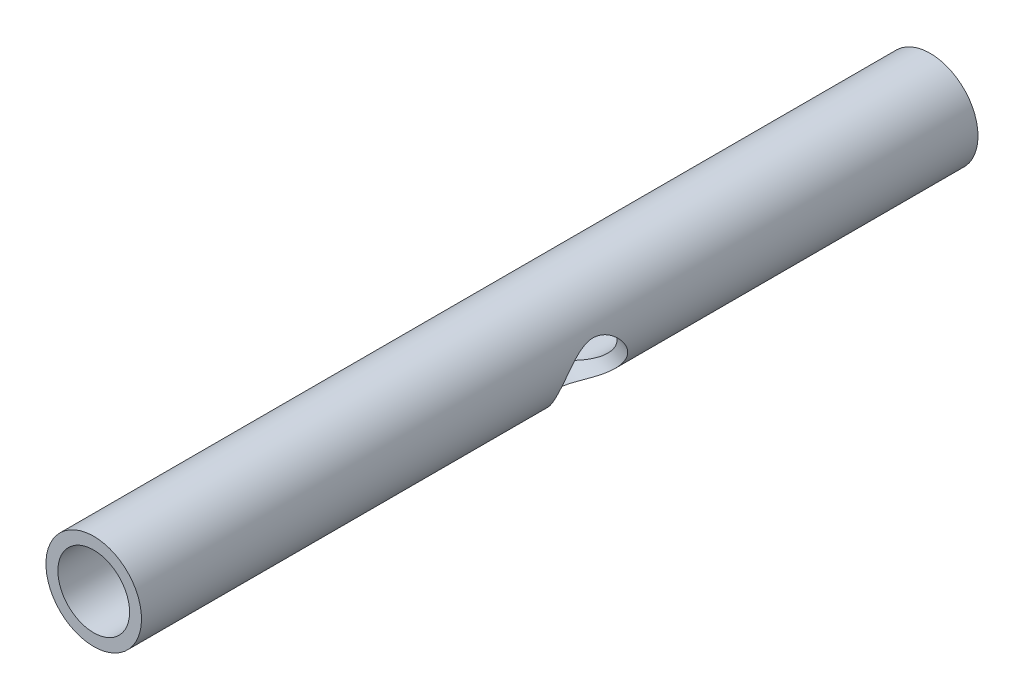
ISO-10303-21;
HEADER;
FILE_DESCRIPTION(('STEP AP214'),'2;1');
FILE_NAME('part.step','',(''),(''),'','','');
FILE_SCHEMA(('AUTOMOTIVE_DESIGN { 1 0 10303 214 1 1 1 1 }'));
ENDSEC;
DATA;
#1=APPLICATION_CONTEXT('core data for automotive mechanical design processes');
#2=APPLICATION_PROTOCOL_DEFINITION('international standard','automotive_design',2000,#1);
#3=PRODUCT_CONTEXT('',#1,'mechanical');
#4=PRODUCT('Part','Part','',(#3));
#5=PRODUCT_RELATED_PRODUCT_CATEGORY('part','',(#4));
#6=PRODUCT_DEFINITION_FORMATION('','',#4);
#7=PRODUCT_DEFINITION_CONTEXT('part definition',#1,'design');
#8=PRODUCT_DEFINITION('design','',#6,#7);
#9=PRODUCT_DEFINITION_SHAPE('','',#8);
#10=(LENGTH_UNIT() NAMED_UNIT(*) SI_UNIT(.MILLI.,.METRE.));
#11=(NAMED_UNIT(*) PLANE_ANGLE_UNIT() SI_UNIT($,.RADIAN.));
#12=(NAMED_UNIT(*) SI_UNIT($,.STERADIAN.) SOLID_ANGLE_UNIT());
#13=UNCERTAINTY_MEASURE_WITH_UNIT(LENGTH_MEASURE(1.E-05),#10,'distance_accuracy_value','');
#14=(GEOMETRIC_REPRESENTATION_CONTEXT(3) GLOBAL_UNCERTAINTY_ASSIGNED_CONTEXT((#13)) GLOBAL_UNIT_ASSIGNED_CONTEXT((#10,
#11,#12)) REPRESENTATION_CONTEXT('',''));
#15=CARTESIAN_POINT('',(0.,0.,0.));
#16=DIRECTION('',(0.,0.,1.));
#17=DIRECTION('',(1.,0.,0.));
#18=AXIS2_PLACEMENT_3D('',#15,#16,#17);
#19=CARTESIAN_POINT('',(80.,-9.99999999999995,-30.9999999999491));
#20=DIRECTION('',(0.,0.,-1.));
#21=DIRECTION('',(-1.,0.,0.));
#22=AXIS2_PLACEMENT_3D('',#19,#20,#21);
#23=CONICAL_SURFACE('',#22,3.49999999990132,0.785398163397448);
#24=CARTESIAN_POINT('',(80.,-9.99999999999995,-31.0000000000628));
#25=DIRECTION('',(0.,0.,-1.));
#26=DIRECTION('',(-1.,0.,0.));
#27=AXIS2_PLACEMENT_3D('',#24,#25,#26);
#28=CIRCLE('',#27,3.500000000015);
#29=CARTESIAN_POINT('',(76.499999999985,-9.99999999999995,-31.0000000000628));
#30=VERTEX_POINT('',#29);
#31=EDGE_CURVE('E50',#30,#30,#28,.F.);
#32=ORIENTED_EDGE('',*,*,#31,.F.);
#33=EDGE_LOOP('',(#32));
#34=FACE_BOUND('',#33,.T.);
#35=CARTESIAN_POINT('',(80.,-9.99999999999995,-30.5));
#36=DIRECTION('',(0.,0.,1.));
#37=DIRECTION('',(1.,0.,0.));
#38=AXIS2_PLACEMENT_3D('',#35,#36,#37);
#39=CIRCLE('',#38,3.);
#40=CARTESIAN_POINT('',(83.,-9.99999999999995,-30.5));
#41=VERTEX_POINT('',#40);
#42=EDGE_CURVE('E75',#41,#41,#39,.T.);
#43=ORIENTED_EDGE('',*,*,#42,.T.);
#44=EDGE_LOOP('',(#43));
#45=FACE_BOUND('',#44,.T.);
#46=ADVANCED_FACE('F15',(#34,#45),#23,.F.);
#47=CARTESIAN_POINT('',(80.,-9.99999999999995,0.));
#48=DIRECTION('',(0.,0.,1.));
#49=DIRECTION('',(1.,0.,0.));
#50=AXIS2_PLACEMENT_3D('',#47,#48,#49);
#51=CYLINDRICAL_SURFACE('',#50,3.);
#52=CARTESIAN_POINT('',(77.,-9.99999999999999,20.25));
#53=CARTESIAN_POINT('',(77.0000031485929,-9.93297141008562,20.2499961102526));
#54=CARTESIAN_POINT('',(77.002269933054,-9.86588731745749,20.244582131157));
#55=CARTESIAN_POINT('',(77.0111072162327,-9.73367931080488,20.2231401272017));
#56=CARTESIAN_POINT('',(77.0176836055028,-9.66855820749588,20.2070975744215));
#57=CARTESIAN_POINT('',(77.0344356916935,-9.54231875275988,20.1650923139111));
#58=CARTESIAN_POINT('',(77.0446008924674,-9.48118933818353,20.1391585173857));
#59=CARTESIAN_POINT('',(77.0675433360689,-9.3641876001995,20.0782376099593));
#60=CARTESIAN_POINT('',(77.0803205719993,-9.30831526291092,20.0432505229637));
#61=CARTESIAN_POINT('',(77.1079212190996,-9.20055335261162,19.9633725568439));
#62=CARTESIAN_POINT('',(77.1228114400232,-9.14896232220842,19.9181022615885));
#63=CARTESIAN_POINT('',(77.152671806227,-9.05384321271223,19.8197389445801));
#64=CARTESIAN_POINT('',(77.1676419937418,-9.010319942958,19.7666412904342));
#65=CARTESIAN_POINT('',(77.196796076901,-8.93044567806568,19.6509500762096));
#66=CARTESIAN_POINT('',(77.2109041324783,-8.8945575572646,19.5880161275675));
#67=CARTESIAN_POINT('',(77.2356530672334,-8.83403912431057,19.4563626360506));
#68=CARTESIAN_POINT('',(77.246298607252,-8.80939366043413,19.3876510286108));
#69=CARTESIAN_POINT('',(77.260399614788,-8.77737850465986,19.2655847979809));
#70=CARTESIAN_POINT('',(77.2650209812007,-8.76713924856231,19.2131025538806));
#71=CARTESIAN_POINT('',(77.2712330011342,-8.75344964092459,19.1070857432364));
#72=CARTESIAN_POINT('',(77.2728242989587,-8.74999784611646,19.0535514028534));
#73=CARTESIAN_POINT('',(77.2728190686612,-8.7500026860229,18.9332181652831));
#74=CARTESIAN_POINT('',(77.2703378239471,-8.75537681379133,18.8664097957));
#75=CARTESIAN_POINT('',(77.2607473180041,-8.77663407274414,18.7348048620552));
#76=CARTESIAN_POINT('',(77.2536341000203,-8.79252618886455,18.6700100676683));
#77=CARTESIAN_POINT('',(77.2357330322845,-8.83409532562654,18.5444489707837));
#78=CARTESIAN_POINT('',(77.224957520494,-8.85973952636007,18.4836699501118));
#79=CARTESIAN_POINT('',(77.2009640856482,-8.91997894687178,18.367265237404));
#80=CARTESIAN_POINT('',(77.187745698744,-8.95457586707752,18.3116405270767));
#81=CARTESIAN_POINT('',(77.1594427344018,-9.03402503869299,18.2036753113188));
#82=CARTESIAN_POINT('',(77.144295034742,-9.07934423021212,18.1516948600436));
#83=CARTESIAN_POINT('',(77.1143577433473,-9.17797620157181,18.0558018837215));
#84=CARTESIAN_POINT('',(77.0995683090171,-9.23129242350862,18.0118928509901));
#85=CARTESIAN_POINT('',(77.0712388171355,-9.34725878744316,17.9315341896755));
#86=CARTESIAN_POINT('',(77.0577817711841,-9.41021531762191,17.8954951477774));
#87=CARTESIAN_POINT('',(77.0344268531216,-9.54192919906956,17.834703337036));
#88=CARTESIAN_POINT('',(77.0245245728619,-9.61067923438856,17.8099365795162));
#89=CARTESIAN_POINT('',(77.0114458630209,-9.73304233609183,17.7776635616942));
#90=CARTESIAN_POINT('',(77.0071802233677,-9.785805833637,17.7673162208655));
#91=CARTESIAN_POINT('',(77.0014566762053,-9.89237403119688,17.7534839483506));
#92=CARTESIAN_POINT('',(76.9999983505844,-9.94617857495584,17.7499979947511));
#93=CARTESIAN_POINT('',(77.0000020553264,-10.0670665373935,17.750002498728));
#94=CARTESIAN_POINT('',(77.0022710860878,-10.1341592871934,17.7554209236394));
#95=CARTESIAN_POINT('',(77.0111116088908,-10.266356953378,17.7768702703918));
#96=CARTESIAN_POINT('',(77.0176863024883,-10.3314603528116,17.7929090893236));
#97=CARTESIAN_POINT('',(77.0344350067992,-10.4576778448451,17.8349060673278));
#98=CARTESIAN_POINT('',(77.0445993903867,-10.518802094793,17.8608377097911));
#99=CARTESIAN_POINT('',(77.0675415010204,-10.6358039500868,17.9217573019073));
#100=CARTESIAN_POINT('',(77.080319599844,-10.6916808073869,17.9567465401095));
#101=CARTESIAN_POINT('',(77.1079223659486,-10.7994512652781,18.0366308912974));
#102=CARTESIAN_POINT('',(77.1228138676326,-10.8510462035746,18.0819055758423));
#103=CARTESIAN_POINT('',(77.1526742741457,-10.9461638535712,18.1802693429486));
#104=CARTESIAN_POINT('',(77.1676432095517,-10.9896830787636,18.2333617829917));
#105=CARTESIAN_POINT('',(77.1967896741966,-11.0695371047609,18.3490263536153));
#106=CARTESIAN_POINT('',(77.2108919313469,-11.1054125786316,18.4119365559983));
#107=CARTESIAN_POINT('',(77.2356441258193,-11.1659390519261,18.5435722870955));
#108=CARTESIAN_POINT('',(77.2462957923642,-11.1905956760581,18.6122948811545));
#109=CARTESIAN_POINT('',(77.2622144403798,-11.2267459714459,18.7501536413292));
#110=CARTESIAN_POINT('',(77.267716115265,-11.2388165612478,18.819110378932));
#111=CARTESIAN_POINT('',(77.2733867374134,-11.251252098337,18.9582731861312));
#112=CARTESIAN_POINT('',(77.2735586176098,-11.2516234835825,19.0284785473382));
#113=CARTESIAN_POINT('',(77.2687488048701,-11.2410845056477,19.1624000478786));
#114=CARTESIAN_POINT('',(77.26416117455,-11.231036818318,19.22620107138));
#115=CARTESIAN_POINT('',(77.2510151757591,-11.2013919146729,19.3511120668469));
#116=CARTESIAN_POINT('',(77.2424560453016,-11.1817928657616,19.4122215199332));
#117=CARTESIAN_POINT('',(77.2221379618468,-11.1332191449996,19.5315588192327));
#118=CARTESIAN_POINT('',(77.2103147413873,-11.1040536810396,19.5896975732394));
#119=CARTESIAN_POINT('',(77.1848161806951,-11.0373109815169,19.7004796953263));
#120=CARTESIAN_POINT('',(77.1711401791667,-10.9997307394069,19.7531210893521));
#121=CARTESIAN_POINT('',(77.1420722691293,-10.9135022074293,19.856092718559));
#122=CARTESIAN_POINT('',(77.1266329485536,-10.8641875405167,19.9058530708663));
#123=CARTESIAN_POINT('',(77.0967471799468,-10.7577442894321,19.9966024842756));
#124=CARTESIAN_POINT('',(77.0823012355198,-10.7006117851581,20.0375871183532));
#125=CARTESIAN_POINT('',(77.0556073312665,-10.5784058318195,20.1104623897812));
#126=CARTESIAN_POINT('',(77.0434195405084,-10.5131763408595,20.1421146215936));
#127=CARTESIAN_POINT('',(77.0230933040136,-10.377739079338,20.1937513394168));
#128=CARTESIAN_POINT('',(77.014946788515,-10.307541552216,20.213759091497));
#129=CARTESIAN_POINT('',(77.00623445695,-10.1972185506113,20.234978706395));
#130=CARTESIAN_POINT('',(77.0039055801491,-10.1580298845302,20.2406019694152));
#131=CARTESIAN_POINT('',(77.0007874321193,-10.0792339410991,20.2481137389503));
#132=CARTESIAN_POINT('',(76.9999981385816,-10.0396266698231,20.2500022995819));
#133=CARTESIAN_POINT('',(77.,-9.99999999999999,20.25));
#134=B_SPLINE_CURVE_WITH_KNOTS('',3,(#52,#53,#54,#55,#56,#57,#58,#59,#60,#61,#62,#63,#64,#65,
#66,#67,#68,#69,#70,#71,#72,#73,#74,#75,#76,#77,#78,#79,#80,#81,#82,#83,#84,#85,#86,#87,#88,#89,
#90,#91,#92,#93,#94,#95,#96,#97,#98,#99,#100,#101,#102,#103,#104,#105,#106,#107,#108,#109,#110,
#111,#112,#113,#114,#115,#116,#117,#118,#119,#120,#121,#122,#123,#124,#125,#126,#127,#128,#129,
#130,#131,#132,#133),.UNSPECIFIED.,.T.,.F.,(4,2,2,2,2,2,2,2,2,2,2,2,2,2,2,2,2,2,2,2,2,2,2,2,2,2,
2,2,2,2,2,2,2,2,2,2,2,2,2,2,4),(0.,0.200931656394963,0.402138529240574,0.602761744665606,
0.803384430345936,1.0131720731547,1.22308437481907,1.44340933708897,1.66343648384763,
1.82395841405542,1.98444620760813,2.18458418218875,2.38489334462946,2.58453426345456,
2.78421312878385,2.99510964356222,3.20609719467891,3.42631905630184,3.64626687687235,
3.8075905365732,3.96889016741626,4.16988461738908,4.37102869048284,4.57163736488476,
4.77227459392608,4.98207938173016,5.19197453837008,5.41220585000535,5.63232662396662,
5.84184272989343,6.05124353913599,6.24459169061227,6.43797695392682,6.63548094370184,
6.83305561333223,7.04730271693782,7.26165764695087,7.48109001435542,7.70008242971594,
7.81887305014383,7.93766194925606),.UNSPECIFIED.);
#135=CARTESIAN_POINT('',(77.,-9.99999999999999,20.25));
#136=VERTEX_POINT('',#135);
#137=EDGE_CURVE('E35',#136,#136,#134,.T.);
#138=ORIENTED_EDGE('',*,*,#137,.T.);
#139=EDGE_LOOP('',(#138));
#140=FACE_BOUND('',#139,.T.);
#141=ORIENTED_EDGE('',*,*,#42,.F.);
#142=EDGE_LOOP('',(#141));
#143=FACE_BOUND('',#142,.T.);
#144=CARTESIAN_POINT('',(80.,-9.99999999999996,0.999999999999992));
#145=DIRECTION('',(-0.612372435695795,0.353553390593274,0.707106781186547));
#146=DIRECTION('',(0.612372435695795,-0.353553390593274,0.707106781186547));
#147=AXIS2_PLACEMENT_3D('',#144,#145,#146);
#148=ELLIPSE('',#147,4.24264068711928,3.);
#149=CARTESIAN_POINT('',(81.5,-7.40192378864665,0.999999999999992));
#150=VERTEX_POINT('',#149);
#151=CARTESIAN_POINT('',(78.5,-12.5980762113533,0.999999999999992));
#152=VERTEX_POINT('',#151);
#153=EDGE_CURVE('E34',#150,#152,#148,.F.);
#154=ORIENTED_EDGE('',*,*,#153,.T.);
#155=CARTESIAN_POINT('',(80.,-9.99999999999996,0.999999999999992));
#156=DIRECTION('',(0.612372435695795,-0.353553390593274,0.707106781186547));
#157=DIRECTION('',(-0.612372435695795,0.353553390593274,0.707106781186547));
#158=AXIS2_PLACEMENT_3D('',#155,#156,#157);
#159=ELLIPSE('',#158,4.24264068711928,3.);
#160=EDGE_CURVE('E30',#152,#150,#159,.T.);
#161=ORIENTED_EDGE('',*,*,#160,.T.);
#162=EDGE_LOOP('',(#154,#161));
#163=FACE_BOUND('',#162,.T.);
#164=CARTESIAN_POINT('',(80.,-9.99999999999995,39.));
#165=DIRECTION('',(0.,0.,1.));
#166=DIRECTION('',(1.,0.,0.));
#167=AXIS2_PLACEMENT_3D('',#164,#165,#166);
#168=CIRCLE('',#167,3.);
#169=CARTESIAN_POINT('',(83.,-9.99999999999995,39.));
#170=VERTEX_POINT('',#169);
#171=EDGE_CURVE('E18',#170,#170,#168,.F.);
#172=ORIENTED_EDGE('',*,*,#171,.F.);
#173=EDGE_LOOP('',(#172));
#174=FACE_BOUND('',#173,.T.);
#175=ADVANCED_FACE('F37',(#140,#143,#163,#174),#51,.F.);
#176=CARTESIAN_POINT('',(80.,-9.99999999999995,39.));
#177=DIRECTION('',(0.,0.,1.));
#178=DIRECTION('',(0.,-1.,0.));
#179=AXIS2_PLACEMENT_3D('',#176,#177,#178);
#180=PLANE('',#179);
#181=ORIENTED_EDGE('',*,*,#171,.T.);
#182=EDGE_LOOP('',(#181));
#183=FACE_BOUND('',#182,.T.);
#184=CARTESIAN_POINT('',(80.,-9.99999999999995,39.));
#185=DIRECTION('',(0.,0.,1.));
#186=DIRECTION('',(1.,0.,0.));
#187=AXIS2_PLACEMENT_3D('',#184,#185,#186);
#188=CIRCLE('',#187,3.99999999999999);
#189=CARTESIAN_POINT('',(84.,-9.99999999999995,39.));
#190=VERTEX_POINT('',#189);
#191=EDGE_CURVE('E39',#190,#190,#188,.F.);
#192=ORIENTED_EDGE('',*,*,#191,.F.);
#193=EDGE_LOOP('',(#192));
#194=FACE_BOUND('',#193,.T.);
#195=ADVANCED_FACE('F92',(#183,#194),#180,.T.);
#196=CARTESIAN_POINT('',(80.,-9.99999999999995,-31.));
#197=DIRECTION('',(0.,0.,-1.));
#198=DIRECTION('',(0.,1.,0.));
#199=AXIS2_PLACEMENT_3D('',#196,#197,#198);
#200=PLANE('',#199);
#201=ORIENTED_EDGE('',*,*,#31,.T.);
#202=EDGE_LOOP('',(#201));
#203=FACE_BOUND('',#202,.T.);
#204=CARTESIAN_POINT('',(80.,-9.99999999999995,-31.));
#205=DIRECTION('',(0.,0.,1.));
#206=DIRECTION('',(1.,0.,0.));
#207=AXIS2_PLACEMENT_3D('',#204,#205,#206);
#208=CIRCLE('',#207,3.99999999999999);
#209=CARTESIAN_POINT('',(84.,-9.99999999999995,-31.));
#210=VERTEX_POINT('',#209);
#211=EDGE_CURVE('E24',#210,#210,#208,.T.);
#212=ORIENTED_EDGE('',*,*,#211,.F.);
#213=EDGE_LOOP('',(#212));
#214=FACE_BOUND('',#213,.T.);
#215=ADVANCED_FACE('F58',(#203,#214),#200,.T.);
#216=CARTESIAN_POINT('',(71.,-10.,19.));
#217=DIRECTION('',(1.,0.,0.));
#218=DIRECTION('',(0.,0.,-1.));
#219=AXIS2_PLACEMENT_3D('',#216,#217,#218);
#220=CYLINDRICAL_SURFACE('',#219,1.25);
#221=ORIENTED_EDGE('',*,*,#137,.F.);
#222=EDGE_LOOP('',(#221));
#223=FACE_BOUND('',#222,.T.);
#224=CARTESIAN_POINT('',(76.,-9.99999999999999,20.25));
#225=CARTESIAN_POINT('',(76.0000020251525,-10.0683983503553,20.249997089946));
#226=CARTESIAN_POINT('',(76.0017722871017,-10.1368321526789,20.2443639413586));
#227=CARTESIAN_POINT('',(76.0086671713613,-10.2717291949991,20.2220256544603));
#228=CARTESIAN_POINT('',(76.0137948056057,-10.3381906095296,20.2053105742628));
#229=CARTESIAN_POINT('',(76.0268423872193,-10.4671315066199,20.1614290196266));
#230=CARTESIAN_POINT('',(76.0347572516335,-10.529617994806,20.1342815621087));
#231=CARTESIAN_POINT('',(76.0525615647099,-10.6491425772014,20.0703779385921));
#232=CARTESIAN_POINT('',(76.0624510678938,-10.7061805209068,20.0336215072717));
#233=CARTESIAN_POINT('',(76.0834977695198,-10.8149647115188,19.9503443990884));
#234=CARTESIAN_POINT('',(76.0946826301296,-10.8665190210913,19.9035800022992));
#235=CARTESIAN_POINT('',(76.1168993242132,-10.9611965882104,19.8021326499573));
#236=CARTESIAN_POINT('',(76.1279311258587,-11.0043181158805,19.7474480736782));
#237=CARTESIAN_POINT('',(76.1488885611228,-11.0819433852917,19.630055393717));
#238=CARTESIAN_POINT('',(76.1587801308197,-11.1162078869362,19.5671824353903));
#239=CARTESIAN_POINT('',(76.1759219918344,-11.1735974444206,19.4362075916197));
#240=CARTESIAN_POINT('',(76.1831729824178,-11.1967254498979,19.3681070962996));
#241=CARTESIAN_POINT('',(76.1939239280998,-11.2304845923177,19.2307719493667));
#242=CARTESIAN_POINT('',(76.1975302678881,-11.2414710915844,19.1616332113861));
#243=CARTESIAN_POINT('',(76.2008994487268,-11.2517455506923,19.0224069367534));
#244=CARTESIAN_POINT('',(76.2006633085349,-11.2510366113475,18.9523196565123));
#245=CARTESIAN_POINT('',(76.1964681141441,-11.2382182633314,18.8161256977021));
#246=CARTESIAN_POINT('',(76.1926566006699,-11.2265606381307,18.7499711878567));
#247=CARTESIAN_POINT('',(76.18197977612,-11.1929082338549,18.6206081437516));
#248=CARTESIAN_POINT('',(76.1751141260551,-11.1709123072808,18.5573999373729));
#249=CARTESIAN_POINT('',(76.1589893279379,-11.1168879864853,18.4346462933404));
#250=CARTESIAN_POINT('',(76.1496966218205,-11.0847174794184,18.3751679977632));
#251=CARTESIAN_POINT('',(76.1297808271913,-11.0113577912565,18.262309172866));
#252=CARTESIAN_POINT('',(76.1191574689666,-10.9701667805043,18.2089298839741));
#253=CARTESIAN_POINT('',(76.0971867290261,-10.8777256419368,18.1072343719559));
#254=CARTESIAN_POINT('',(76.0858283646841,-10.8261039525203,18.0592576887474));
#255=CARTESIAN_POINT('',(76.0640880244257,-10.7153847106219,17.9725419400664));
#256=CARTESIAN_POINT('',(76.0537064717623,-10.6562839432234,17.9338068679272));
#257=CARTESIAN_POINT('',(76.0349787186611,-10.5316126201002,17.8664426602129));
#258=CARTESIAN_POINT('',(76.0266505789373,-10.4659913161207,17.8379022731191));
#259=CARTESIAN_POINT('',(76.0131112354126,-10.3306316372002,17.7924159050898));
#260=CARTESIAN_POINT('',(76.0078936210112,-10.2609020575595,17.7754460675146));
#261=CARTESIAN_POINT('',(76.0030276443032,-10.1587861185369,17.7597161746866));
#262=CARTESIAN_POINT('',(76.0018955118841,-10.1271543683117,17.7560768501917));
#263=CARTESIAN_POINT('',(76.000381089834,-10.063687043886,17.7512178813518));
#264=CARTESIAN_POINT('',(75.9999988029739,-10.0318514689327,17.7499982459481));
#265=CARTESIAN_POINT('',(76.0000025686256,-9.93165186609865,17.7500037639132));
#266=CARTESIAN_POINT('',(76.001770937245,-9.86323054636155,17.7556315698541));
#267=CARTESIAN_POINT('',(76.0086627910451,-9.72832013053954,17.7779602740434));
#268=CARTESIAN_POINT('',(76.0137920652938,-9.66183457550959,17.7946802789214));
#269=CARTESIAN_POINT('',(76.0268431043991,-9.53286329763506,17.83857332315));
#270=CARTESIAN_POINT('',(76.0347589170115,-9.47036938192279,17.8657240928496));
#271=CARTESIAN_POINT('',(76.0525636151853,-9.3508451038793,17.9296297426552));
#272=CARTESIAN_POINT('',(76.0624521446464,-9.29381375823097,17.9663828897804));
#273=CARTESIAN_POINT('',(76.0834966404831,-9.1850412839193,18.0496509931743));
#274=CARTESIAN_POINT('',(76.0946802610435,-9.13349202802216,18.0964095874382));
#275=CARTESIAN_POINT('',(76.1168969639795,-9.03881251508043,18.1978561665884));
#276=CARTESIAN_POINT('',(76.127929981616,-8.99568577878212,18.252547450888));
#277=CARTESIAN_POINT('',(76.1488937186033,-8.91803786383804,18.3699715132654));
#278=CARTESIAN_POINT('',(76.1587898330723,-8.88375976575894,18.4328716329124));
#279=CARTESIAN_POINT('',(76.1759288736448,-8.82637939305645,18.5638650146045));
#280=CARTESIAN_POINT('',(76.1831750426238,-8.80326344754828,18.6319518052623));
#281=CARTESIAN_POINT('',(76.1924437290276,-8.77416663262354,18.7502968602264));
#282=CARTESIAN_POINT('',(76.195382112328,-8.76512222037882,18.7997512484144));
#283=CARTESIAN_POINT('',(76.1993255557756,-8.7530380282334,18.8994640304035));
#284=CARTESIAN_POINT('',(76.2003307586178,-8.74999780514116,18.9497223645862));
#285=CARTESIAN_POINT('',(76.2003265202122,-8.75000298190668,19.0683065416712));
#286=CARTESIAN_POINT('',(76.1984654001524,-8.75562153299091,19.1366487087561));
#287=CARTESIAN_POINT('',(76.1912476792322,-8.77789656466366,19.2713550163566));
#288=CARTESIAN_POINT('',(76.1858878272534,-8.79456331176483,19.3377172570342));
#289=CARTESIAN_POINT('',(76.172339958116,-8.8383039420492,19.4664485098777));
#290=CARTESIAN_POINT('',(76.1641576718761,-8.86535674894353,19.5288253125544));
#291=CARTESIAN_POINT('',(76.1458944553972,-8.92903636980362,19.6481616395826));
#292=CARTESIAN_POINT('',(76.1358134754031,-8.96566343467182,19.7051210219121));
#293=CARTESIAN_POINT('',(76.1144997706207,-9.0487996892397,19.8139733463759));
#294=CARTESIAN_POINT('',(76.1032409634492,-9.09558098331777,19.865653408148));
#295=CARTESIAN_POINT('',(76.0810596927437,-9.19712766353906,19.9605876044058));
#296=CARTESIAN_POINT('',(76.0701373431249,-9.25189571856195,20.0038389109817));
#297=CARTESIAN_POINT('',(76.0495594991756,-9.36940060297522,20.0816295563105));
#298=CARTESIAN_POINT('',(76.039938924966,-9.43229175581578,20.1159456124845));
#299=CARTESIAN_POINT('',(76.0233679111717,-9.56326727041521,20.1733989127124));
#300=CARTESIAN_POINT('',(76.0164143233515,-9.63134539467974,20.1965493455591));
#301=CARTESIAN_POINT('',(76.0075327484912,-9.74977888101407,20.2257324768391));
#302=CARTESIAN_POINT('',(76.0047234210014,-9.79933795223515,20.234815003102));
#303=CARTESIAN_POINT('',(76.0009563587631,-9.89925830446189,20.2469496480241));
#304=CARTESIAN_POINT('',(75.9999985083248,-9.94961953514621,20.2500021434709));
#305=CARTESIAN_POINT('',(76.,-9.99999999999999,20.25));
#306=B_SPLINE_CURVE_WITH_KNOTS('',3,(#224,#225,#226,#227,#228,#229,#230,#231,#232,#233,#234,
#235,#236,#237,#238,#239,#240,#241,#242,#243,#244,#245,#246,#247,#248,#249,#250,#251,#252,#253,
#254,#255,#256,#257,#258,#259,#260,#261,#262,#263,#264,#265,#266,#267,#268,#269,#270,#271,#272,
#273,#274,#275,#276,#277,#278,#279,#280,#281,#282,#283,#284,#285,#286,#287,#288,#289,#290,#291,
#292,#293,#294,#295,#296,#297,#298,#299,#300,#301,#302,#303,#304,#305),.UNSPECIFIED.,.T.,.F.,(4,
2,2,2,2,2,2,2,2,2,2,2,2,2,2,2,2,2,2,2,2,2,2,2,2,2,2,2,2,2,2,2,2,2,2,2,2,2,2,2,4),(0.,
0.205006580759303,0.410197327527034,0.615015797983124,0.819839924459958,1.03037622902152,
1.24095567719205,1.45673786346186,1.67246286569463,1.88169142173089,2.0908645058476,
2.29176870198444,2.49269520273552,2.69656223799828,2.90047066261736,3.11362939823523,
3.32688007436616,3.54194436010105,3.75656386545212,3.85206074489865,3.94755797723431,
4.15247969172973,4.35775530944214,4.56259507826353,4.76739790430978,4.9779118751955,
5.18851365677514,5.40439979873052,5.62002085849936,5.77072572603115,5.9214194690602,
6.12615002874301,6.33107110105313,6.53557850929403,6.74009127738166,6.95096967444071,
7.16191870141358,7.37772009567345,7.59326595803144,7.74427796652743,7.89528053871057),.UNSPECIFIED.);
#307=CARTESIAN_POINT('',(76.,-9.99999999999999,20.25));
#308=VERTEX_POINT('',#307);
#309=EDGE_CURVE('E42',#308,#308,#306,.T.);
#310=ORIENTED_EDGE('',*,*,#309,.F.);
#311=EDGE_LOOP('',(#310));
#312=FACE_BOUND('',#311,.T.);
#313=ADVANCED_FACE('F53',(#223,#312),#220,.F.);
#314=CARTESIAN_POINT('',(80.,-9.99999999999999,0.999999999999992));
#315=DIRECTION('',(0.866025403784439,-0.5,0.));
#316=DIRECTION('',(0.5,0.866025403784439,0.));
#317=AXIS2_PLACEMENT_3D('',#314,#315,#316);
#318=CYLINDRICAL_SURFACE('',#317,3.);
#319=CARTESIAN_POINT('',(83.7912878474779,-8.72479944417897,0.999999999999992));
#320=CARTESIAN_POINT('',(83.7912881298022,-8.72480004254399,0.929971593291256));
#321=CARTESIAN_POINT('',(83.7924810675797,-8.72832895664328,0.859942798283066));
#322=CARTESIAN_POINT('',(83.7971275400379,-8.74227562303325,0.720671082277144));
#323=CARTESIAN_POINT('',(83.800581200678,-8.75269375916688,0.651428205286634));
#324=CARTESIAN_POINT('',(83.8139111812939,-8.79378888567094,0.445521248224977));
#325=CARTESIAN_POINT('',(83.8267546658252,-8.83430432326942,0.310941832375854));
#326=CARTESIAN_POINT('',(83.8562016630741,-8.93585614176065,0.0527915276035708));
#327=CARTESIAN_POINT('',(83.87275069007,-8.99660082156192,-0.0709059179081913));
#328=CARTESIAN_POINT('',(83.9058510566799,-9.13434731723403,-0.308698444977446));
#329=CARTESIAN_POINT('',(83.9224023944475,-9.21134471681539,-0.422796123287723));
#330=CARTESIAN_POINT('',(83.955469158527,-9.39601291588142,-0.664225207018501));
#331=CARTESIAN_POINT('',(83.9712503598917,-9.50673029837465,-0.789320017337038));
#332=CARTESIAN_POINT('',(83.9935662380844,-9.74380547825542,-1.02506684614928));
#333=CARTESIAN_POINT('',(84.000087166482,-9.87018622873591,-1.13569716906632));
#334=CARTESIAN_POINT('',(83.9999459343238,-10.0826687283266,-1.29998989255907));
#335=CARTESIAN_POINT('',(83.9974917467537,-10.1648271515789,-1.35882433359489));
#336=CARTESIAN_POINT('',(83.9870032062308,-10.3330085171787,-1.4700991171741));
#337=CARTESIAN_POINT('',(83.9789714511594,-10.4190296429433,-1.52254242317446));
#338=CARTESIAN_POINT('',(83.9566158877796,-10.5941108220704,-1.62036533970842));
#339=CARTESIAN_POINT('',(83.9422991069649,-10.6831673791281,-1.6657527631213));
#340=CARTESIAN_POINT('',(83.9067777327843,-10.8634394750304,-1.74877063390058));
#341=CARTESIAN_POINT('',(83.8855770855948,-10.9546537492549,-1.78640550526351));
#342=CARTESIAN_POINT('',(83.8259454672321,-11.1746228517718,-1.86641094497635));
#343=CARTESIAN_POINT('',(83.7840159213563,-11.3039424706072,-1.90475696984658));
#344=CARTESIAN_POINT('',(83.6854453857046,-11.5608696161898,-1.96279448168619));
#345=CARTESIAN_POINT('',(83.628849044989,-11.6884811239198,-1.98254175628663));
#346=CARTESIAN_POINT('',(83.5494085040537,-11.8447126895067,-1.99497711779223));
#347=CARTESIAN_POINT('',(83.5329404644992,-11.8760570213944,-1.99685888821852));
#348=CARTESIAN_POINT('',(83.4991529924221,-11.9383448468152,-1.99937060607732));
#349=CARTESIAN_POINT('',(83.4818334294181,-11.9692882779935,-2.00000036104344));
#350=CARTESIAN_POINT('',(83.4274743110833,-12.0634389443844,-1.99999925421915));
#351=CARTESIAN_POINT('',(83.3890880081266,-12.1258892291769,-1.99730992156754));
#352=CARTESIAN_POINT('',(83.3091658818136,-12.2482843897445,-1.98660708569458));
#353=CARTESIAN_POINT('',(83.2676280776554,-12.3082276524584,-1.97859020899846));
#354=CARTESIAN_POINT('',(83.1387168349111,-12.4838437249456,-1.94666802708884));
#355=CARTESIAN_POINT('',(83.0471416720133,-12.5951373247813,-1.91489159711167));
#356=CARTESIAN_POINT('',(82.8573857161283,-12.8026915037311,-1.8325740663558));
#357=CARTESIAN_POINT('',(82.7592483244455,-12.8990391104215,-1.78214786682017));
#358=CARTESIAN_POINT('',(82.559512983905,-13.0768104651075,-1.66491226896751));
#359=CARTESIAN_POINT('',(82.4579161790566,-13.1582390909699,-1.59810824226044));
#360=CARTESIAN_POINT('',(82.2450863681543,-13.3133840126773,-1.44347665831085));
#361=CARTESIAN_POINT('',(82.1338323850853,-13.3856875012361,-1.35427499329985));
#362=CARTESIAN_POINT('',(81.9147315545665,-13.5142494569769,-1.16100048791614));
#363=CARTESIAN_POINT('',(81.8068903226636,-13.570482589417,-1.05690455030535));
#364=CARTESIAN_POINT('',(81.640218999319,-13.6489020166217,-0.879464583015171));
#365=CARTESIAN_POINT('',(81.5789644123044,-13.6757315579741,-0.810369736971212));
#366=CARTESIAN_POINT('',(81.4601192334305,-13.7245367204723,-0.667410552257107));
#367=CARTESIAN_POINT('',(81.4025297490311,-13.7465108794105,-0.593544785446335));
#368=CARTESIAN_POINT('',(81.2922538069512,-13.7859615959125,-0.4412277789806));
#369=CARTESIAN_POINT('',(81.2395614827679,-13.8034435803426,-0.362782214056025));
#370=CARTESIAN_POINT('',(81.1404091098969,-13.8343401283235,-0.201292770914147));
#371=CARTESIAN_POINT('',(81.09394805249,-13.8477553506472,-0.118249640034549));
#372=CARTESIAN_POINT('',(80.995676929554,-13.8745276401842,0.0789622554796341));
#373=CARTESIAN_POINT('',(80.9467077932462,-13.8865652665355,0.194769732667325));
#374=CARTESIAN_POINT('',(80.8670319029629,-13.9051192867534,0.43279701961075));
#375=CARTESIAN_POINT('',(80.8362833626613,-13.9116483284708,0.55500145224856));
#376=CARTESIAN_POINT('',(80.7969047798005,-13.919871141864,0.804362026968642));
#377=CARTESIAN_POINT('',(80.7884758206739,-13.9215209707343,0.931552778324546));
#378=CARTESIAN_POINT('',(80.7957841079273,-13.9200426790517,1.18523066722938));
#379=CARTESIAN_POINT('',(80.8115300173413,-13.916912845715,1.31171753623964));
#380=CARTESIAN_POINT('',(80.8617304501799,-13.9061440284479,1.54638250568542));
#381=CARTESIAN_POINT('',(80.8940059000841,-13.899022647949,1.65507269333709));
#382=CARTESIAN_POINT('',(80.9724717814796,-13.880197176029,1.86687781249218));
#383=CARTESIAN_POINT('',(81.0186755834922,-13.8684886779542,1.96998727409212));
#384=CARTESIAN_POINT('',(81.1539908506198,-13.8308999831578,2.23251273673633));
#385=CARTESIAN_POINT('',(81.2518625666372,-13.8007363815082,2.38680080887755));
#386=CARTESIAN_POINT('',(81.465056007434,-13.7237804673388,2.67839304003722));
#387=CARTESIAN_POINT('',(81.5804198866722,-13.6769476058165,2.81565467342198));
#388=CARTESIAN_POINT('',(81.8242243269271,-13.5624176995384,3.07550680022247));
#389=CARTESIAN_POINT('',(81.9529208772132,-13.4942253373481,3.19764125316235));
#390=CARTESIAN_POINT('',(82.2142446109988,-13.3347373978391,3.42052732705877));
#391=CARTESIAN_POINT('',(82.3468637092975,-13.243486767678,3.52131985496037));
#392=CARTESIAN_POINT('',(82.5831983930638,-13.0569581402753,3.6799615699377));
#393=CARTESIAN_POINT('',(82.6873765973056,-12.9661579602416,3.74236913810311));
#394=CARTESIAN_POINT('',(82.8902852073165,-12.7687952963472,3.84844972530491));
#395=CARTESIAN_POINT('',(82.9890189868764,-12.662242728092,3.8921344627793));
#396=CARTESIAN_POINT('',(83.1775022629279,-12.434228225889,3.95850675278547));
#397=CARTESIAN_POINT('',(83.2671931864986,-12.312679182879,3.98106439643867));
#398=CARTESIAN_POINT('',(83.4329076577883,-12.0586648563681,4.00309919098279));
#399=CARTESIAN_POINT('',(83.5089369796675,-11.9262042194079,4.00258611600134));
#400=CARTESIAN_POINT('',(83.6377863632977,-11.6688711082842,3.97977827336566));
#401=CARTESIAN_POINT('',(83.6921714825752,-11.5445749717882,3.95967896899598));
#402=CARTESIAN_POINT('',(83.7870152703008,-11.2947498634258,3.90205240960396));
#403=CARTESIAN_POINT('',(83.8274709692424,-11.169220634545,3.86452144245979));
#404=CARTESIAN_POINT('',(83.8960229500515,-10.9158845352323,3.77222551351882));
#405=CARTESIAN_POINT('',(83.9236327892226,-10.7881535739412,3.71689920423551));
#406=CARTESIAN_POINT('',(83.9657042531351,-10.537878491535,3.59165580453841));
#407=CARTESIAN_POINT('',(83.9801638182969,-10.4153351857685,3.52173643068476));
#408=CARTESIAN_POINT('',(83.999307211551,-10.1577598845704,3.35642930406857));
#409=CARTESIAN_POINT('',(84.0019541067786,-10.0240620735718,3.2587381513744));
#410=CARTESIAN_POINT('',(83.9953771588278,-9.76931596063705,3.04795576025991));
#411=CARTESIAN_POINT('',(83.9861284110427,-9.64829477267757,2.93483265741126));
#412=CARTESIAN_POINT('',(83.9650507583297,-9.46804822751683,2.74321002555926));
#413=CARTESIAN_POINT('',(83.9557815695144,-9.40363788549811,2.66923010168341));
#414=CARTESIAN_POINT('',(83.9353794806379,-9.28122817420904,2.5163086464663));
#415=CARTESIAN_POINT('',(83.9242459991002,-9.2232308145603,2.43736557192156));
#416=CARTESIAN_POINT('',(83.9012126903134,-9.11478353402486,2.27474589692767));
#417=CARTESIAN_POINT('',(83.8893142472083,-9.06432050120027,2.191077877545));
#418=CARTESIAN_POINT('',(83.8659643510017,-8.97209760089094,2.0189515905399));
#419=CARTESIAN_POINT('',(83.8545128914491,-8.93033760775881,1.93049339209741));
#420=CARTESIAN_POINT('',(83.8362491843006,-8.86687334050936,1.77333191993239));
#421=CARTESIAN_POINT('',(83.8290134333102,-8.8427894138444,1.70563780749389));
#422=CARTESIAN_POINT('',(83.8160882415792,-8.80085314622569,1.56821277939792));
#423=CARTESIAN_POINT('',(83.8103980653466,-8.78299784010715,1.49848285008136));
#424=CARTESIAN_POINT('',(83.8010763445942,-8.75418724729877,1.35770637712236));
#425=CARTESIAN_POINT('',(83.7974379355196,-8.74320893855116,1.28666505494894));
#426=CARTESIAN_POINT('',(83.7925436453557,-8.7285150447471,1.14374924301467));
#427=CARTESIAN_POINT('',(83.7912875577097,-8.72479883003703,1.07187482603021));
#428=CARTESIAN_POINT('',(83.7912878474779,-8.72479944417897,0.999999999999992));
#429=B_SPLINE_CURVE_WITH_KNOTS('',3,(#319,#320,#321,#322,#323,#324,#325,#326,#327,#328,#329,
#330,#331,#332,#333,#334,#335,#336,#337,#338,#339,#340,#341,#342,#343,#344,#345,#346,#347,#348,
#349,#350,#351,#352,#353,#354,#355,#356,#357,#358,#359,#360,#361,#362,#363,#364,#365,#366,#367,
#368,#369,#370,#371,#372,#373,#374,#375,#376,#377,#378,#379,#380,#381,#382,#383,#384,#385,#386,
#387,#388,#389,#390,#391,#392,#393,#394,#395,#396,#397,#398,#399,#400,#401,#402,#403,#404,#405,
#406,#407,#408,#409,#410,#411,#412,#413,#414,#415,#416,#417,#418,#419,#420,#421,#422,#423,#424,
#425,#426,#427,#428),.UNSPECIFIED.,.T.,.F.,(4,2,2,2,2,2,2,2,2,2,2,2,2,2,2,2,2,2,2,2,2,2,2,2,2,2,
2,2,2,2,2,2,2,2,2,2,2,2,2,2,2,2,2,2,2,2,2,2,2,2,2,2,2,2,4),(0.,0.209983419270159,
0.419978539055246,0.840743130465549,1.25568568758693,1.67051563876282,2.17226788469043,
2.67476429005573,2.97764131613294,3.28037736475726,3.58277577301504,3.88500113653023,
4.30688519310292,4.72749972465043,4.83385111214725,4.94021884727405,5.15993485120138,
5.37979011508713,5.82006640389211,6.25767414952678,6.6951385598627,7.17312013154864,
7.6518511307899,7.94005426585394,8.22834407590085,8.51628395637329,8.80417716865039,
9.1817359911282,9.55842555138145,9.9384974473893,10.318705573479,10.6582834957239,
10.9981884394852,11.5507322932065,12.1046295346455,12.6724634587116,13.2391989374021,
13.6922756048001,14.1450682803144,14.6006272085831,15.0559931368323,15.4655693838113,
15.8752328912276,16.2993506230851,16.7235347682968,17.2185902487404,17.7146838617321,
18.0099715636454,18.3053515385053,18.6002113188568,18.8950668419682,19.1114365868916,
19.3277031869359,19.5432418689415,19.7587618620216),.UNSPECIFIED.);
#430=CARTESIAN_POINT('',(83.7912878474779,-8.72479944417897,0.999999999999992));
#431=VERTEX_POINT('',#430);
#432=EDGE_CURVE('E9',#431,#431,#429,.T.);
#433=ORIENTED_EDGE('',*,*,#432,.F.);
#434=EDGE_LOOP('',(#433));
#435=FACE_BOUND('',#434,.T.);
#436=ORIENTED_EDGE('',*,*,#160,.F.);
#437=ORIENTED_EDGE('',*,*,#153,.F.);
#438=EDGE_LOOP('',(#436,#437));
#439=FACE_BOUND('',#438,.T.);
#440=ADVANCED_FACE('F33',(#435,#439),#318,.F.);
#441=CARTESIAN_POINT('',(80.,-9.99999999999995,0.));
#442=DIRECTION('',(0.,0.,1.));
#443=DIRECTION('',(1.,0.,0.));
#444=AXIS2_PLACEMENT_3D('',#441,#442,#443);
#445=CYLINDRICAL_SURFACE('',#444,3.99999999999999);
#446=ORIENTED_EDGE('',*,*,#309,.T.);
#447=EDGE_LOOP('',(#446));
#448=FACE_BOUND('',#447,.T.);
#449=ORIENTED_EDGE('',*,*,#211,.T.);
#450=EDGE_LOOP('',(#449));
#451=FACE_BOUND('',#450,.T.);
#452=ORIENTED_EDGE('',*,*,#432,.T.);
#453=EDGE_LOOP('',(#452));
#454=FACE_BOUND('',#453,.T.);
#455=ORIENTED_EDGE('',*,*,#191,.T.);
#456=EDGE_LOOP('',(#455));
#457=FACE_BOUND('',#456,.T.);
#458=ADVANCED_FACE('F67',(#448,#451,#454,#457),#445,.T.);
#459=CLOSED_SHELL('',(#46,#175,#195,#215,#313,#440,#458));
#460=MANIFOLD_SOLID_BREP('B1',#459);
#461=ADVANCED_BREP_SHAPE_REPRESENTATION('',(#18,#460),#14);
#462=SHAPE_DEFINITION_REPRESENTATION(#9,#461);
ENDSEC;
END-ISO-10303-21;
